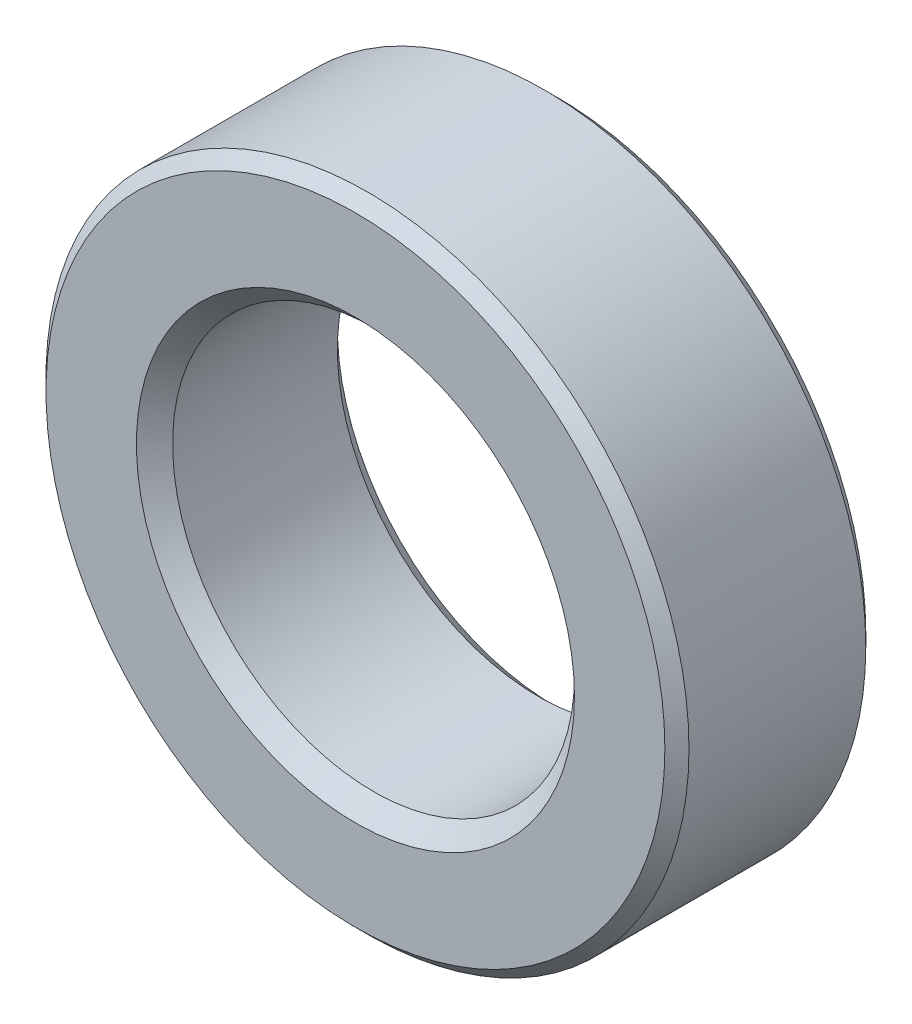
ISO-10303-21;
HEADER;
FILE_DESCRIPTION(('STEP AP214'),'2;1');
FILE_NAME('part.step','',(''),(''),'','','');
FILE_SCHEMA(('AUTOMOTIVE_DESIGN { 1 0 10303 214 1 1 1 1 }'));
ENDSEC;
DATA;
#1=APPLICATION_CONTEXT('core data for automotive mechanical design processes');
#2=APPLICATION_PROTOCOL_DEFINITION('international standard','automotive_design',2000,#1);
#3=PRODUCT_CONTEXT('',#1,'mechanical');
#4=PRODUCT('Part','Part','',(#3));
#5=PRODUCT_RELATED_PRODUCT_CATEGORY('part','',(#4));
#6=PRODUCT_DEFINITION_FORMATION('','',#4);
#7=PRODUCT_DEFINITION_CONTEXT('part definition',#1,'design');
#8=PRODUCT_DEFINITION('design','',#6,#7);
#9=PRODUCT_DEFINITION_SHAPE('','',#8);
#10=(LENGTH_UNIT() NAMED_UNIT(*) SI_UNIT(.MILLI.,.METRE.));
#11=(NAMED_UNIT(*) PLANE_ANGLE_UNIT() SI_UNIT($,.RADIAN.));
#12=(NAMED_UNIT(*) SI_UNIT($,.STERADIAN.) SOLID_ANGLE_UNIT());
#13=UNCERTAINTY_MEASURE_WITH_UNIT(LENGTH_MEASURE(1.E-05),#10,'distance_accuracy_value','');
#14=(GEOMETRIC_REPRESENTATION_CONTEXT(3) GLOBAL_UNCERTAINTY_ASSIGNED_CONTEXT((#13)) GLOBAL_UNIT_ASSIGNED_CONTEXT((#10,
#11,#12)) REPRESENTATION_CONTEXT('',''));
#15=CARTESIAN_POINT('',(0.,0.,0.));
#16=DIRECTION('',(0.,0.,1.));
#17=DIRECTION('',(1.,0.,0.));
#18=AXIS2_PLACEMENT_3D('',#15,#16,#17);
#19=CARTESIAN_POINT('',(0.,0.,-2.5));
#20=DIRECTION('',(0.,0.,1.));
#21=DIRECTION('',(1.,0.,0.));
#22=AXIS2_PLACEMENT_3D('',#19,#20,#21);
#23=CYLINDRICAL_SURFACE('',#22,8.);
#24=CARTESIAN_POINT('',(0.,0.,2.20000000000001));
#25=DIRECTION('',(0.,0.,1.));
#26=DIRECTION('',(1.,0.,0.));
#27=AXIS2_PLACEMENT_3D('',#24,#25,#26);
#28=CIRCLE('',#27,8.);
#29=CARTESIAN_POINT('',(8.,0.,2.20000000000001));
#30=VERTEX_POINT('',#29);
#31=EDGE_CURVE('E58',#30,#30,#28,.F.);
#32=ORIENTED_EDGE('',*,*,#31,.T.);
#33=EDGE_LOOP('',(#32));
#34=FACE_BOUND('',#33,.T.);
#35=CARTESIAN_POINT('',(0.,0.,-2.2));
#36=DIRECTION('',(0.,0.,1.));
#37=DIRECTION('',(1.,0.,0.));
#38=AXIS2_PLACEMENT_3D('',#35,#36,#37);
#39=CIRCLE('',#38,8.);
#40=CARTESIAN_POINT('',(8.,0.,-2.2));
#41=VERTEX_POINT('',#40);
#42=EDGE_CURVE('E61',#41,#41,#39,.T.);
#43=ORIENTED_EDGE('',*,*,#42,.T.);
#44=EDGE_LOOP('',(#43));
#45=FACE_BOUND('',#44,.T.);
#46=ADVANCED_FACE('F35',(#34,#45),#23,.T.);
#47=CARTESIAN_POINT('',(0.,0.,-2.5));
#48=DIRECTION('',(0.,0.,1.));
#49=DIRECTION('',(1.,0.,0.));
#50=AXIS2_PLACEMENT_3D('',#47,#48,#49);
#51=PLANE('',#50);
#52=CARTESIAN_POINT('',(0.,0.,-2.5));
#53=DIRECTION('',(0.,0.,1.));
#54=DIRECTION('',(1.,0.,0.));
#55=AXIS2_PLACEMENT_3D('',#52,#53,#54);
#56=CIRCLE('',#55,5.45);
#57=CARTESIAN_POINT('',(5.45,0.,-2.5));
#58=VERTEX_POINT('',#57);
#59=EDGE_CURVE('E10',#58,#58,#56,.T.);
#60=ORIENTED_EDGE('',*,*,#59,.T.);
#61=EDGE_LOOP('',(#60));
#62=FACE_BOUND('',#61,.T.);
#63=CARTESIAN_POINT('',(0.,0.,-2.5));
#64=DIRECTION('',(0.,0.,1.));
#65=DIRECTION('',(1.,0.,0.));
#66=AXIS2_PLACEMENT_3D('',#63,#64,#65);
#67=CIRCLE('',#66,7.7);
#68=CARTESIAN_POINT('',(7.7,0.,-2.5));
#69=VERTEX_POINT('',#68);
#70=EDGE_CURVE('E55',#69,#69,#67,.F.);
#71=ORIENTED_EDGE('',*,*,#70,.T.);
#72=EDGE_LOOP('',(#71));
#73=FACE_BOUND('',#72,.T.);
#74=ADVANCED_FACE('F87',(#62,#73),#51,.F.);
#75=CARTESIAN_POINT('',(0.,0.,-2.5));
#76=DIRECTION('',(0.,0.,1.));
#77=DIRECTION('',(1.,0.,0.));
#78=AXIS2_PLACEMENT_3D('',#75,#76,#77);
#79=CYLINDRICAL_SURFACE('',#78,5.);
#80=CARTESIAN_POINT('',(0.,0.,2.05));
#81=DIRECTION('',(0.,0.,1.));
#82=DIRECTION('',(1.,0.,0.));
#83=AXIS2_PLACEMENT_3D('',#80,#81,#82);
#84=CIRCLE('',#83,5.);
#85=CARTESIAN_POINT('',(5.,0.,2.05));
#86=VERTEX_POINT('',#85);
#87=EDGE_CURVE('E46',#86,#86,#84,.T.);
#88=ORIENTED_EDGE('',*,*,#87,.T.);
#89=EDGE_LOOP('',(#88));
#90=FACE_BOUND('',#89,.T.);
#91=CARTESIAN_POINT('',(0.,0.,-2.05));
#92=DIRECTION('',(0.,0.,1.));
#93=DIRECTION('',(1.,0.,0.));
#94=AXIS2_PLACEMENT_3D('',#91,#92,#93);
#95=CIRCLE('',#94,5.);
#96=CARTESIAN_POINT('',(5.,0.,-2.05));
#97=VERTEX_POINT('',#96);
#98=EDGE_CURVE('E50',#97,#97,#95,.F.);
#99=ORIENTED_EDGE('',*,*,#98,.T.);
#100=EDGE_LOOP('',(#99));
#101=FACE_BOUND('',#100,.T.);
#102=ADVANCED_FACE('F83',(#90,#101),#79,.F.);
#103=CARTESIAN_POINT('',(0.,0.,2.5));
#104=DIRECTION('',(0.,0.,1.));
#105=DIRECTION('',(1.,0.,0.));
#106=AXIS2_PLACEMENT_3D('',#103,#104,#105);
#107=PLANE('',#106);
#108=CARTESIAN_POINT('',(0.,0.,2.5));
#109=DIRECTION('',(0.,0.,1.));
#110=DIRECTION('',(1.,0.,0.));
#111=AXIS2_PLACEMENT_3D('',#108,#109,#110);
#112=CIRCLE('',#111,5.45);
#113=CARTESIAN_POINT('',(5.45,0.,2.5));
#114=VERTEX_POINT('',#113);
#115=EDGE_CURVE('E42',#114,#114,#112,.F.);
#116=ORIENTED_EDGE('',*,*,#115,.T.);
#117=EDGE_LOOP('',(#116));
#118=FACE_BOUND('',#117,.T.);
#119=CARTESIAN_POINT('',(0.,0.,2.5));
#120=DIRECTION('',(0.,0.,1.));
#121=DIRECTION('',(1.,0.,0.));
#122=AXIS2_PLACEMENT_3D('',#119,#120,#121);
#123=CIRCLE('',#122,7.70000000000001);
#124=CARTESIAN_POINT('',(7.70000000000001,0.,2.5));
#125=VERTEX_POINT('',#124);
#126=EDGE_CURVE('E64',#125,#125,#123,.T.);
#127=ORIENTED_EDGE('',*,*,#126,.T.);
#128=EDGE_LOOP('',(#127));
#129=FACE_BOUND('',#128,.T.);
#130=ADVANCED_FACE('F68',(#118,#129),#107,.T.);
#131=CARTESIAN_POINT('',(0.,0.,2.5));
#132=DIRECTION('',(0.,0.,-1.));
#133=DIRECTION('',(-1.,0.,0.));
#134=AXIS2_PLACEMENT_3D('',#131,#132,#133);
#135=CONICAL_SURFACE('',#134,7.70000000000001,0.785398163397445);
#136=ORIENTED_EDGE('',*,*,#31,.F.);
#137=EDGE_LOOP('',(#136));
#138=FACE_BOUND('',#137,.T.);
#139=ORIENTED_EDGE('',*,*,#126,.F.);
#140=EDGE_LOOP('',(#139));
#141=FACE_BOUND('',#140,.T.);
#142=ADVANCED_FACE('F70',(#138,#141),#135,.T.);
#143=CARTESIAN_POINT('',(0.,0.,-2.2));
#144=DIRECTION('',(0.,0.,1.));
#145=DIRECTION('',(1.,0.,0.));
#146=AXIS2_PLACEMENT_3D('',#143,#144,#145);
#147=CONICAL_SURFACE('',#146,8.,0.785398163397445);
#148=ORIENTED_EDGE('',*,*,#70,.F.);
#149=EDGE_LOOP('',(#148));
#150=FACE_BOUND('',#149,.T.);
#151=ORIENTED_EDGE('',*,*,#42,.F.);
#152=EDGE_LOOP('',(#151));
#153=FACE_BOUND('',#152,.T.);
#154=ADVANCED_FACE('F72',(#150,#153),#147,.T.);
#155=CARTESIAN_POINT('',(0.,0.,2.05));
#156=DIRECTION('',(0.,0.,1.));
#157=DIRECTION('',(1.,0.,0.));
#158=AXIS2_PLACEMENT_3D('',#155,#156,#157);
#159=CONICAL_SURFACE('',#158,5.,0.785398163397447);
#160=ORIENTED_EDGE('',*,*,#115,.F.);
#161=EDGE_LOOP('',(#160));
#162=FACE_BOUND('',#161,.T.);
#163=ORIENTED_EDGE('',*,*,#87,.F.);
#164=EDGE_LOOP('',(#163));
#165=FACE_BOUND('',#164,.T.);
#166=ADVANCED_FACE('F79',(#162,#165),#159,.F.);
#167=CARTESIAN_POINT('',(0.,0.,-2.5));
#168=DIRECTION('',(0.,0.,-1.));
#169=DIRECTION('',(-1.,0.,0.));
#170=AXIS2_PLACEMENT_3D('',#167,#168,#169);
#171=CONICAL_SURFACE('',#170,5.45,0.785398163397447);
#172=ORIENTED_EDGE('',*,*,#98,.F.);
#173=EDGE_LOOP('',(#172));
#174=FACE_BOUND('',#173,.T.);
#175=ORIENTED_EDGE('',*,*,#59,.F.);
#176=EDGE_LOOP('',(#175));
#177=FACE_BOUND('',#176,.T.);
#178=ADVANCED_FACE('F37',(#174,#177),#171,.F.);
#179=CLOSED_SHELL('',(#46,#74,#102,#130,#142,#154,#166,#178));
#180=MANIFOLD_SOLID_BREP('B2',#179);
#181=ADVANCED_BREP_SHAPE_REPRESENTATION('',(#18,#180),#14);
#182=SHAPE_DEFINITION_REPRESENTATION(#9,#181);
ENDSEC;
END-ISO-10303-21;
